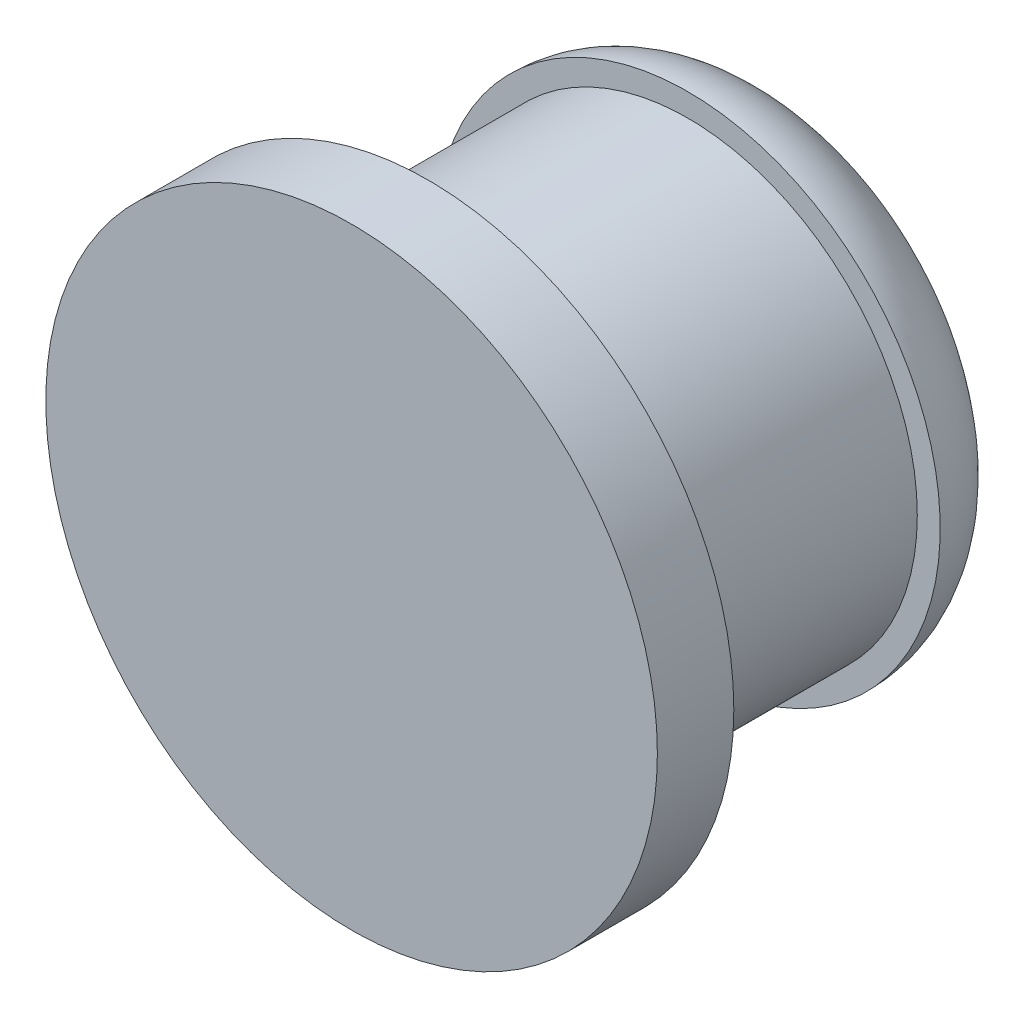
ISO-10303-21;
HEADER;
FILE_DESCRIPTION(('STEP AP214'),'2;1');
FILE_NAME('part.step','',(''),(''),'','','');
FILE_SCHEMA(('AUTOMOTIVE_DESIGN { 1 0 10303 214 1 1 1 1 }'));
ENDSEC;
DATA;
#1=APPLICATION_CONTEXT('core data for automotive mechanical design processes');
#2=APPLICATION_PROTOCOL_DEFINITION('international standard','automotive_design',2000,#1);
#3=PRODUCT_CONTEXT('',#1,'mechanical');
#4=PRODUCT('Part','Part','',(#3));
#5=PRODUCT_RELATED_PRODUCT_CATEGORY('part','',(#4));
#6=PRODUCT_DEFINITION_FORMATION('','',#4);
#7=PRODUCT_DEFINITION_CONTEXT('part definition',#1,'design');
#8=PRODUCT_DEFINITION('design','',#6,#7);
#9=PRODUCT_DEFINITION_SHAPE('','',#8);
#10=(LENGTH_UNIT() NAMED_UNIT(*) SI_UNIT(.MILLI.,.METRE.));
#11=(NAMED_UNIT(*) PLANE_ANGLE_UNIT() SI_UNIT($,.RADIAN.));
#12=(NAMED_UNIT(*) SI_UNIT($,.STERADIAN.) SOLID_ANGLE_UNIT());
#13=UNCERTAINTY_MEASURE_WITH_UNIT(LENGTH_MEASURE(1.E-05),#10,'distance_accuracy_value','');
#14=(GEOMETRIC_REPRESENTATION_CONTEXT(3) GLOBAL_UNCERTAINTY_ASSIGNED_CONTEXT((#13)) GLOBAL_UNIT_ASSIGNED_CONTEXT((#10,
#11,#12)) REPRESENTATION_CONTEXT('',''));
#15=CARTESIAN_POINT('',(0.,0.,0.));
#16=DIRECTION('',(0.,0.,1.));
#17=DIRECTION('',(1.,0.,0.));
#18=AXIS2_PLACEMENT_3D('',#15,#16,#17);
#19=CARTESIAN_POINT('',(21.5715121450865,0.,0.5));
#20=DIRECTION('',(0.,0.,-1.));
#21=DIRECTION('',(-1.,0.,0.));
#22=AXIS2_PLACEMENT_3D('',#19,#20,#21);
#23=CYLINDRICAL_SURFACE('',#22,2.);
#24=CARTESIAN_POINT('',(21.5715121450865,0.,0.5));
#25=DIRECTION('',(0.,0.,1.));
#26=DIRECTION('',(1.,0.,0.));
#27=AXIS2_PLACEMENT_3D('',#24,#25,#26);
#28=CIRCLE('',#27,2.);
#29=CARTESIAN_POINT('',(23.5715121450865,0.,0.5));
#30=VERTEX_POINT('',#29);
#31=EDGE_CURVE('E42',#30,#30,#28,.T.);
#32=ORIENTED_EDGE('',*,*,#31,.F.);
#33=EDGE_LOOP('',(#32));
#34=FACE_BOUND('',#33,.T.);
#35=CARTESIAN_POINT('',(21.5715121450865,0.,0.));
#36=DIRECTION('',(0.,0.,1.));
#37=DIRECTION('',(1.,0.,0.));
#38=AXIS2_PLACEMENT_3D('',#35,#36,#37);
#39=CIRCLE('',#38,2.);
#40=CARTESIAN_POINT('',(23.5715121450865,0.,0.));
#41=VERTEX_POINT('',#40);
#42=EDGE_CURVE('E46',#41,#41,#39,.T.);
#43=ORIENTED_EDGE('',*,*,#42,.T.);
#44=EDGE_LOOP('',(#43));
#45=FACE_BOUND('',#44,.T.);
#46=ADVANCED_FACE('F31',(#34,#45),#23,.T.);
#47=CARTESIAN_POINT('',(21.5715121450865,0.,0.5));
#48=DIRECTION('',(0.,0.,1.));
#49=DIRECTION('',(1.,0.,0.));
#50=AXIS2_PLACEMENT_3D('',#47,#48,#49);
#51=PLANE('',#50);
#52=ORIENTED_EDGE('',*,*,#31,.T.);
#53=EDGE_LOOP('',(#52));
#54=FACE_BOUND('',#53,.T.);
#55=ADVANCED_FACE('F73',(#54),#51,.T.);
#56=CARTESIAN_POINT('',(21.5715121450865,0.,0.));
#57=DIRECTION('',(0.,0.,1.));
#58=DIRECTION('',(1.,0.,0.));
#59=AXIS2_PLACEMENT_3D('',#56,#57,#58);
#60=PLANE('',#59);
#61=CARTESIAN_POINT('',(21.5715121450865,0.,0.));
#62=DIRECTION('',(0.,0.,1.));
#63=DIRECTION('',(1.,0.,0.));
#64=AXIS2_PLACEMENT_3D('',#61,#62,#63);
#65=CIRCLE('',#64,1.5);
#66=CARTESIAN_POINT('',(23.0715121450865,0.,0.));
#67=VERTEX_POINT('',#66);
#68=EDGE_CURVE('E38',#67,#67,#65,.F.);
#69=ORIENTED_EDGE('',*,*,#68,.F.);
#70=EDGE_LOOP('',(#69));
#71=FACE_BOUND('',#70,.T.);
#72=ORIENTED_EDGE('',*,*,#42,.F.);
#73=EDGE_LOOP('',(#72));
#74=FACE_BOUND('',#73,.T.);
#75=ADVANCED_FACE('F78',(#71,#74),#60,.F.);
#76=CARTESIAN_POINT('',(21.5715121450865,0.,-1.7));
#77=DIRECTION('',(0.,0.,1.));
#78=DIRECTION('',(1.,0.,0.));
#79=AXIS2_PLACEMENT_3D('',#76,#77,#78);
#80=CYLINDRICAL_SURFACE('',#79,1.5);
#81=CARTESIAN_POINT('',(21.5715121450865,0.,-1.7));
#82=DIRECTION('',(0.,0.,-1.));
#83=DIRECTION('',(-1.,0.,0.));
#84=AXIS2_PLACEMENT_3D('',#81,#82,#83);
#85=CIRCLE('',#84,1.5);
#86=CARTESIAN_POINT('',(20.0715121450865,0.,-1.7));
#87=VERTEX_POINT('',#86);
#88=EDGE_CURVE('E50',#87,#87,#85,.T.);
#89=ORIENTED_EDGE('',*,*,#88,.F.);
#90=EDGE_LOOP('',(#89));
#91=FACE_BOUND('',#90,.T.);
#92=ORIENTED_EDGE('',*,*,#68,.T.);
#93=EDGE_LOOP('',(#92));
#94=FACE_BOUND('',#93,.T.);
#95=ADVANCED_FACE('F69',(#91,#94),#80,.T.);
#96=CARTESIAN_POINT('',(21.5715121450865,0.,-2.3));
#97=DIRECTION('',(0.,0.,-1.));
#98=DIRECTION('',(-1.,0.,0.));
#99=AXIS2_PLACEMENT_3D('',#96,#97,#98);
#100=PLANE('',#99);
#101=CARTESIAN_POINT('',(21.5715121450865,0.,-2.3));
#102=DIRECTION('',(0.,0.,-1.));
#103=DIRECTION('',(-1.,0.,0.));
#104=AXIS2_PLACEMENT_3D('',#101,#102,#103);
#105=CIRCLE('',#104,1.05);
#106=CARTESIAN_POINT('',(20.5215121450865,0.,-2.3));
#107=VERTEX_POINT('',#106);
#108=EDGE_CURVE('E10',#107,#107,#105,.T.);
#109=ORIENTED_EDGE('',*,*,#108,.T.);
#110=EDGE_LOOP('',(#109));
#111=FACE_BOUND('',#110,.T.);
#112=ADVANCED_FACE('F62',(#111),#100,.T.);
#113=CARTESIAN_POINT('',(21.5715121450865,0.,-1.7));
#114=DIRECTION('',(0.,0.,-1.));
#115=DIRECTION('',(-1.,0.,0.));
#116=AXIS2_PLACEMENT_3D('',#113,#114,#115);
#117=PLANE('',#116);
#118=ORIENTED_EDGE('',*,*,#88,.T.);
#119=EDGE_LOOP('',(#118));
#120=FACE_BOUND('',#119,.T.);
#121=CARTESIAN_POINT('',(21.5715121450865,0.,-1.7));
#122=DIRECTION('',(0.,0.,-1.));
#123=DIRECTION('',(-1.,0.,0.));
#124=AXIS2_PLACEMENT_3D('',#121,#122,#123);
#125=CIRCLE('',#124,1.65);
#126=CARTESIAN_POINT('',(19.9215121450865,0.,-1.7));
#127=VERTEX_POINT('',#126);
#128=EDGE_CURVE('E54',#127,#127,#125,.T.);
#129=ORIENTED_EDGE('',*,*,#128,.F.);
#130=EDGE_LOOP('',(#129));
#131=FACE_BOUND('',#130,.T.);
#132=ADVANCED_FACE('F60',(#120,#131),#117,.F.);
#133=CARTESIAN_POINT('',(21.5715121450865,0.,-1.7));
#134=DIRECTION('',(0.,0.,-1.));
#135=DIRECTION('',(-1.,0.,0.));
#136=AXIS2_PLACEMENT_3D('',#133,#134,#135);
#137=TOROIDAL_SURFACE('',#136,1.05,0.6);
#138=ORIENTED_EDGE('',*,*,#128,.T.);
#139=EDGE_LOOP('',(#138));
#140=FACE_BOUND('',#139,.T.);
#141=ORIENTED_EDGE('',*,*,#108,.F.);
#142=EDGE_LOOP('',(#141));
#143=FACE_BOUND('',#142,.T.);
#144=ADVANCED_FACE('F33',(#140,#143),#137,.T.);
#145=CLOSED_SHELL('',(#46,#55,#75,#95,#112,#132,#144));
#146=MANIFOLD_SOLID_BREP('B2',#145);
#147=ADVANCED_BREP_SHAPE_REPRESENTATION('',(#18,#146),#14);
#148=SHAPE_DEFINITION_REPRESENTATION(#9,#147);
ENDSEC;
END-ISO-10303-21;
